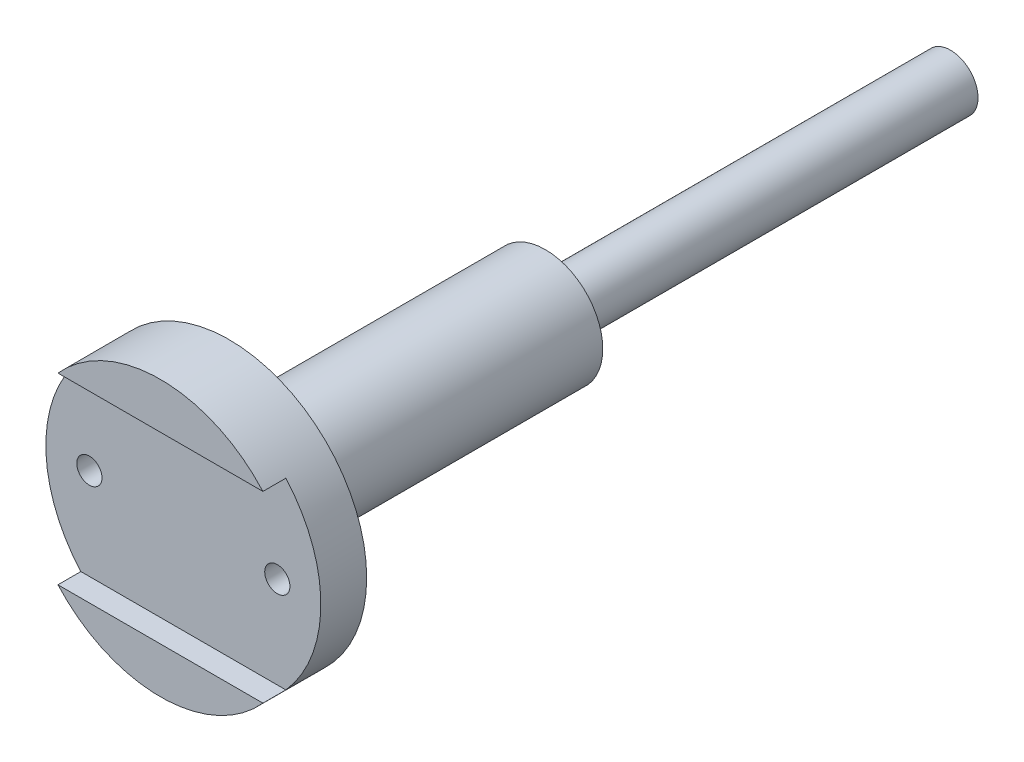
ISO-10303-21;
HEADER;
FILE_DESCRIPTION(('STEP AP214'),'2;1');
FILE_NAME('part.step','',(''),(''),'','','');
FILE_SCHEMA(('AUTOMOTIVE_DESIGN { 1 0 10303 214 1 1 1 1 }'));
ENDSEC;
DATA;
#1=APPLICATION_CONTEXT('core data for automotive mechanical design processes');
#2=APPLICATION_PROTOCOL_DEFINITION('international standard','automotive_design',2000,#1);
#3=PRODUCT_CONTEXT('',#1,'mechanical');
#4=PRODUCT('Part','Part','',(#3));
#5=PRODUCT_RELATED_PRODUCT_CATEGORY('part','',(#4));
#6=PRODUCT_DEFINITION_FORMATION('','',#4);
#7=PRODUCT_DEFINITION_CONTEXT('part definition',#1,'design');
#8=PRODUCT_DEFINITION('design','',#6,#7);
#9=PRODUCT_DEFINITION_SHAPE('','',#8);
#10=(LENGTH_UNIT() NAMED_UNIT(*) SI_UNIT(.MILLI.,.METRE.));
#11=(NAMED_UNIT(*) PLANE_ANGLE_UNIT() SI_UNIT($,.RADIAN.));
#12=(NAMED_UNIT(*) SI_UNIT($,.STERADIAN.) SOLID_ANGLE_UNIT());
#13=UNCERTAINTY_MEASURE_WITH_UNIT(LENGTH_MEASURE(1.E-05),#10,'distance_accuracy_value','');
#14=(GEOMETRIC_REPRESENTATION_CONTEXT(3) GLOBAL_UNCERTAINTY_ASSIGNED_CONTEXT((#13)) GLOBAL_UNIT_ASSIGNED_CONTEXT((#10,
#11,#12)) REPRESENTATION_CONTEXT('',''));
#15=CARTESIAN_POINT('',(0.,0.,0.));
#16=DIRECTION('',(0.,0.,1.));
#17=DIRECTION('',(1.,0.,0.));
#18=AXIS2_PLACEMENT_3D('',#15,#16,#17);
#19=CARTESIAN_POINT('',(0.,0.,0.));
#20=DIRECTION('',(0.,0.,1.));
#21=DIRECTION('',(1.,0.,0.));
#22=AXIS2_PLACEMENT_3D('',#19,#20,#21);
#23=PLANE('',#22);
#24=CARTESIAN_POINT('',(20.5,0.,0.));
#25=DIRECTION('',(0.,0.,-1.));
#26=DIRECTION('',(-1.,0.,0.));
#27=AXIS2_PLACEMENT_3D('',#24,#25,#26);
#28=CIRCLE('',#27,6.12);
#29=CARTESIAN_POINT('',(14.38,0.,0.));
#30=VERTEX_POINT('',#29);
#31=EDGE_CURVE('E150',#30,#30,#28,.T.);
#32=ORIENTED_EDGE('',*,*,#31,.F.);
#33=EDGE_LOOP('',(#32));
#34=FACE_BOUND('',#33,.T.);
#35=CARTESIAN_POINT('',(0.,0.,0.));
#36=DIRECTION('',(0.,0.,1.));
#37=DIRECTION('',(1.,0.,0.));
#38=AXIS2_PLACEMENT_3D('',#35,#36,#37);
#39=CIRCLE('',#38,12.5);
#40=CARTESIAN_POINT('',(12.5,0.,0.));
#41=VERTEX_POINT('',#40);
#42=EDGE_CURVE('E186',#41,#41,#39,.F.);
#43=ORIENTED_EDGE('',*,*,#42,.F.);
#44=EDGE_LOOP('',(#43));
#45=FACE_BOUND('',#44,.T.);
#46=CARTESIAN_POINT('',(0.,0.,0.));
#47=DIRECTION('',(0.,0.,1.));
#48=DIRECTION('',(1.,0.,0.));
#49=AXIS2_PLACEMENT_3D('',#46,#47,#48);
#50=CIRCLE('',#49,30.);
#51=CARTESIAN_POINT('',(30.,0.,0.));
#52=VERTEX_POINT('',#51);
#53=EDGE_CURVE('E182',#52,#52,#50,.T.);
#54=ORIENTED_EDGE('',*,*,#53,.F.);
#55=EDGE_LOOP('',(#54));
#56=FACE_BOUND('',#55,.T.);
#57=CARTESIAN_POINT('',(-20.5,0.,0.));
#58=DIRECTION('',(0.,0.,-1.));
#59=DIRECTION('',(-1.,0.,0.));
#60=AXIS2_PLACEMENT_3D('',#57,#58,#59);
#61=CIRCLE('',#60,6.12);
#62=CARTESIAN_POINT('',(-26.62,0.,0.));
#63=VERTEX_POINT('',#62);
#64=EDGE_CURVE('E135',#63,#63,#61,.T.);
#65=ORIENTED_EDGE('',*,*,#64,.F.);
#66=EDGE_LOOP('',(#65));
#67=FACE_BOUND('',#66,.T.);
#68=ADVANCED_FACE('F35',(#34,#45,#56,#67),#23,.F.);
#69=CARTESIAN_POINT('',(0.,0.,15.));
#70=DIRECTION('',(0.,0.,1.));
#71=DIRECTION('',(1.,0.,0.));
#72=AXIS2_PLACEMENT_3D('',#69,#70,#71);
#73=PLANE('',#72);
#74=DIRECTION('',(-1.,0.,0.));
#75=VECTOR('',#74,1.);
#76=CARTESIAN_POINT('',(0.,20.,15.));
#77=LINE('',#76,#75);
#78=CARTESIAN_POINT('',(22.3606797749979,20.,15.));
#79=VERTEX_POINT('',#78);
#80=CARTESIAN_POINT('',(-22.3606797749979,20.,15.));
#81=VERTEX_POINT('',#80);
#82=EDGE_CURVE('E194',#79,#81,#77,.T.);
#83=ORIENTED_EDGE('',*,*,#82,.F.);
#84=CARTESIAN_POINT('',(0.,0.,15.));
#85=DIRECTION('',(0.,0.,1.));
#86=DIRECTION('',(1.,0.,0.));
#87=AXIS2_PLACEMENT_3D('',#84,#85,#86);
#88=CIRCLE('',#87,30.);
#89=EDGE_CURVE('E183',#79,#81,#88,.T.);
#90=ORIENTED_EDGE('',*,*,#89,.T.);
#91=EDGE_LOOP('',(#83,#90));
#92=FACE_BOUND('',#91,.T.);
#93=ADVANCED_FACE('F216',(#92),#73,.T.);
#94=CARTESIAN_POINT('',(0.,0.,15.));
#95=DIRECTION('',(0.,0.,-1.));
#96=DIRECTION('',(-1.,0.,0.));
#97=AXIS2_PLACEMENT_3D('',#94,#95,#96);
#98=CYLINDRICAL_SURFACE('',#97,30.);
#99=ORIENTED_EDGE('',*,*,#89,.F.);
#100=DIRECTION('',(0.,0.,-1.));
#101=VECTOR('',#100,1.);
#102=CARTESIAN_POINT('',(22.3606797749979,20.,15.));
#103=LINE('',#102,#101);
#104=CARTESIAN_POINT('',(22.3606797749979,20.,10.));
#105=VERTEX_POINT('',#104);
#106=EDGE_CURVE('E176',#79,#105,#103,.T.);
#107=ORIENTED_EDGE('',*,*,#106,.T.);
#108=CARTESIAN_POINT('',(0.,0.,10.));
#109=DIRECTION('',(0.,0.,-1.));
#110=DIRECTION('',(-1.,0.,0.));
#111=AXIS2_PLACEMENT_3D('',#108,#109,#110);
#112=CIRCLE('',#111,30.);
#113=CARTESIAN_POINT('',(22.3606797749979,-20.,10.));
#114=VERTEX_POINT('',#113);
#115=EDGE_CURVE('E199',#105,#114,#112,.T.);
#116=ORIENTED_EDGE('',*,*,#115,.T.);
#117=DIRECTION('',(0.,0.,-1.));
#118=VECTOR('',#117,1.);
#119=CARTESIAN_POINT('',(22.3606797749979,-20.,15.));
#120=LINE('',#119,#118);
#121=CARTESIAN_POINT('',(22.3606797749979,-20.,15.));
#122=VERTEX_POINT('',#121);
#123=EDGE_CURVE('E169',#114,#122,#120,.F.);
#124=ORIENTED_EDGE('',*,*,#123,.T.);
#125=CARTESIAN_POINT('',(-22.3606797749979,-20.,15.));
#126=VERTEX_POINT('',#125);
#127=EDGE_CURVE('E187',#126,#122,#88,.T.);
#128=ORIENTED_EDGE('',*,*,#127,.F.);
#129=DIRECTION('',(0.,0.,-1.));
#130=VECTOR('',#129,1.);
#131=CARTESIAN_POINT('',(-22.3606797749979,-20.,15.));
#132=LINE('',#131,#130);
#133=CARTESIAN_POINT('',(-22.3606797749979,-20.,10.));
#134=VERTEX_POINT('',#133);
#135=EDGE_CURVE('E58',#126,#134,#132,.T.);
#136=ORIENTED_EDGE('',*,*,#135,.T.);
#137=CARTESIAN_POINT('',(-22.3606797749979,20.,10.));
#138=VERTEX_POINT('',#137);
#139=EDGE_CURVE('E196',#134,#138,#112,.T.);
#140=ORIENTED_EDGE('',*,*,#139,.T.);
#141=DIRECTION('',(0.,0.,-1.));
#142=VECTOR('',#141,1.);
#143=CARTESIAN_POINT('',(-22.3606797749979,20.,15.));
#144=LINE('',#143,#142);
#145=EDGE_CURVE('E173',#138,#81,#144,.F.);
#146=ORIENTED_EDGE('',*,*,#145,.T.);
#147=EDGE_LOOP('',(#99,#107,#116,#124,#128,#136,#140,#146));
#148=FACE_BOUND('',#147,.T.);
#149=ORIENTED_EDGE('',*,*,#53,.T.);
#150=EDGE_LOOP('',(#149));
#151=FACE_BOUND('',#150,.T.);
#152=ADVANCED_FACE('F37',(#148,#151),#98,.T.);
#153=DIRECTION('',(1.,0.,0.));
#154=VECTOR('',#153,1.);
#155=CARTESIAN_POINT('',(0.,-20.,15.));
#156=LINE('',#155,#154);
#157=EDGE_CURVE('E192',#126,#122,#156,.T.);
#158=ORIENTED_EDGE('',*,*,#157,.F.);
#159=ORIENTED_EDGE('',*,*,#127,.T.);
#160=EDGE_LOOP('',(#158,#159));
#161=FACE_BOUND('',#160,.T.);
#162=ADVANCED_FACE('F219',(#161),#73,.T.);
#163=CARTESIAN_POINT('',(0.,0.,-69.));
#164=DIRECTION('',(0.,0.,1.));
#165=DIRECTION('',(1.,0.,0.));
#166=AXIS2_PLACEMENT_3D('',#163,#164,#165);
#167=CYLINDRICAL_SURFACE('',#166,12.5);
#168=CARTESIAN_POINT('',(0.,0.,-69.));
#169=DIRECTION('',(0.,0.,-1.));
#170=DIRECTION('',(-1.,0.,0.));
#171=AXIS2_PLACEMENT_3D('',#168,#169,#170);
#172=CIRCLE('',#171,12.5);
#173=CARTESIAN_POINT('',(-12.5,0.,-69.));
#174=VERTEX_POINT('',#173);
#175=EDGE_CURVE('E179',#174,#174,#172,.T.);
#176=ORIENTED_EDGE('',*,*,#175,.F.);
#177=EDGE_LOOP('',(#176));
#178=FACE_BOUND('',#177,.T.);
#179=ORIENTED_EDGE('',*,*,#42,.T.);
#180=EDGE_LOOP('',(#179));
#181=FACE_BOUND('',#180,.T.);
#182=ADVANCED_FACE('F227',(#178,#181),#167,.T.);
#183=CARTESIAN_POINT('',(0.,0.,-69.));
#184=DIRECTION('',(0.,0.,-1.));
#185=DIRECTION('',(-1.,0.,0.));
#186=AXIS2_PLACEMENT_3D('',#183,#184,#185);
#187=PLANE('',#186);
#188=CARTESIAN_POINT('',(0.,0.,-69.));
#189=DIRECTION('',(0.,0.,-1.));
#190=DIRECTION('',(-1.,0.,0.));
#191=AXIS2_PLACEMENT_3D('',#188,#189,#190);
#192=CIRCLE('',#191,6.);
#193=CARTESIAN_POINT('',(-6.,0.,-69.));
#194=VERTEX_POINT('',#193);
#195=EDGE_CURVE('E131',#194,#194,#192,.T.);
#196=ORIENTED_EDGE('',*,*,#195,.F.);
#197=EDGE_LOOP('',(#196));
#198=FACE_BOUND('',#197,.T.);
#199=ORIENTED_EDGE('',*,*,#175,.T.);
#200=EDGE_LOOP('',(#199));
#201=FACE_BOUND('',#200,.T.);
#202=ADVANCED_FACE('F232',(#198,#201),#187,.T.);
#203=CARTESIAN_POINT('',(0.,0.,10.));
#204=DIRECTION('',(0.,0.,-1.));
#205=DIRECTION('',(-1.,0.,0.));
#206=AXIS2_PLACEMENT_3D('',#203,#204,#205);
#207=PLANE('',#206);
#208=CARTESIAN_POINT('',(-20.5,0.,10.));
#209=DIRECTION('',(0.,0.,-1.));
#210=DIRECTION('',(-1.,0.,0.));
#211=AXIS2_PLACEMENT_3D('',#208,#209,#210);
#212=CIRCLE('',#211,2.75);
#213=CARTESIAN_POINT('',(-23.25,0.,10.));
#214=VERTEX_POINT('',#213);
#215=EDGE_CURVE('E149',#214,#214,#212,.T.);
#216=ORIENTED_EDGE('',*,*,#215,.T.);
#217=EDGE_LOOP('',(#216));
#218=FACE_BOUND('',#217,.T.);
#219=CARTESIAN_POINT('',(20.5,0.,10.));
#220=DIRECTION('',(0.,0.,-1.));
#221=DIRECTION('',(-1.,0.,0.));
#222=AXIS2_PLACEMENT_3D('',#219,#220,#221);
#223=CIRCLE('',#222,2.75);
#224=CARTESIAN_POINT('',(17.75,0.,10.));
#225=VERTEX_POINT('',#224);
#226=EDGE_CURVE('E162',#225,#225,#223,.T.);
#227=ORIENTED_EDGE('',*,*,#226,.T.);
#228=EDGE_LOOP('',(#227));
#229=FACE_BOUND('',#228,.T.);
#230=DIRECTION('',(-1.,0.,0.));
#231=VECTOR('',#230,1.);
#232=CARTESIAN_POINT('',(115.,20.,10.));
#233=LINE('',#232,#231);
#234=EDGE_CURVE('E166',#105,#138,#233,.T.);
#235=ORIENTED_EDGE('',*,*,#234,.T.);
#236=ORIENTED_EDGE('',*,*,#139,.F.);
#237=DIRECTION('',(1.,0.,0.));
#238=VECTOR('',#237,1.);
#239=CARTESIAN_POINT('',(115.,-20.,10.));
#240=LINE('',#239,#238);
#241=EDGE_CURVE('E163',#134,#114,#240,.T.);
#242=ORIENTED_EDGE('',*,*,#241,.T.);
#243=ORIENTED_EDGE('',*,*,#115,.F.);
#244=EDGE_LOOP('',(#235,#236,#242,#243));
#245=FACE_BOUND('',#244,.T.);
#246=ADVANCED_FACE('F211',(#218,#229,#245),#207,.F.);
#247=CARTESIAN_POINT('',(115.,20.,10.));
#248=DIRECTION('',(0.,1.,0.));
#249=DIRECTION('',(-1.,0.,0.));
#250=AXIS2_PLACEMENT_3D('',#247,#248,#249);
#251=PLANE('',#250);
#252=ORIENTED_EDGE('',*,*,#82,.T.);
#253=ORIENTED_EDGE('',*,*,#145,.F.);
#254=ORIENTED_EDGE('',*,*,#234,.F.);
#255=ORIENTED_EDGE('',*,*,#106,.F.);
#256=EDGE_LOOP('',(#252,#253,#254,#255));
#257=FACE_BOUND('',#256,.T.);
#258=ADVANCED_FACE('F213',(#257),#251,.F.);
#259=CARTESIAN_POINT('',(115.,-20.,10.));
#260=DIRECTION('',(0.,-1.,0.));
#261=DIRECTION('',(1.,0.,0.));
#262=AXIS2_PLACEMENT_3D('',#259,#260,#261);
#263=PLANE('',#262);
#264=ORIENTED_EDGE('',*,*,#157,.T.);
#265=ORIENTED_EDGE('',*,*,#123,.F.);
#266=ORIENTED_EDGE('',*,*,#241,.F.);
#267=ORIENTED_EDGE('',*,*,#135,.F.);
#268=EDGE_LOOP('',(#264,#265,#266,#267));
#269=FACE_BOUND('',#268,.T.);
#270=ADVANCED_FACE('F234',(#269),#263,.F.);
#271=CARTESIAN_POINT('',(20.5,0.,0.));
#272=DIRECTION('',(0.,0.,-1.));
#273=DIRECTION('',(-1.,0.,0.));
#274=AXIS2_PLACEMENT_3D('',#271,#272,#273);
#275=CYLINDRICAL_SURFACE('',#274,2.75);
#276=CARTESIAN_POINT('',(20.5,0.,3.60500000000001));
#277=DIRECTION('',(0.,0.,-1.));
#278=DIRECTION('',(-1.,0.,0.));
#279=AXIS2_PLACEMENT_3D('',#276,#277,#278);
#280=CIRCLE('',#279,2.75);
#281=CARTESIAN_POINT('',(17.75,0.,3.60500000000001));
#282=VERTEX_POINT('',#281);
#283=EDGE_CURVE('E159',#282,#282,#280,.T.);
#284=ORIENTED_EDGE('',*,*,#283,.T.);
#285=EDGE_LOOP('',(#284));
#286=FACE_BOUND('',#285,.T.);
#287=ORIENTED_EDGE('',*,*,#226,.F.);
#288=EDGE_LOOP('',(#287));
#289=FACE_BOUND('',#288,.T.);
#290=ADVANCED_FACE('F236',(#286,#289),#275,.F.);
#291=CARTESIAN_POINT('',(20.5,0.,3.58));
#292=DIRECTION('',(0.,0.,-1.));
#293=DIRECTION('',(-1.,0.,0.));
#294=AXIS2_PLACEMENT_3D('',#291,#292,#293);
#295=CONICAL_SURFACE('',#294,2.775,0.785398163397292);
#296=ORIENTED_EDGE('',*,*,#283,.F.);
#297=EDGE_LOOP('',(#296));
#298=FACE_BOUND('',#297,.T.);
#299=CARTESIAN_POINT('',(20.5,0.,3.58));
#300=DIRECTION('',(0.,0.,-1.));
#301=DIRECTION('',(-1.,0.,0.));
#302=AXIS2_PLACEMENT_3D('',#299,#300,#301);
#303=CIRCLE('',#302,2.775);
#304=CARTESIAN_POINT('',(17.725,0.,3.58));
#305=VERTEX_POINT('',#304);
#306=EDGE_CURVE('E156',#305,#305,#303,.T.);
#307=ORIENTED_EDGE('',*,*,#306,.T.);
#308=EDGE_LOOP('',(#307));
#309=FACE_BOUND('',#308,.T.);
#310=ADVANCED_FACE('F242',(#298,#309),#295,.F.);
#311=CARTESIAN_POINT('',(23.275,0.,3.58));
#312=DIRECTION('',(0.,0.,1.));
#313=DIRECTION('',(1.,0.,0.));
#314=AXIS2_PLACEMENT_3D('',#311,#312,#313);
#315=PLANE('',#314);
#316=ORIENTED_EDGE('',*,*,#306,.F.);
#317=EDGE_LOOP('',(#316));
#318=FACE_BOUND('',#317,.T.);
#319=CARTESIAN_POINT('',(20.5,0.,3.58));
#320=DIRECTION('',(0.,0.,-1.));
#321=DIRECTION('',(-1.,0.,0.));
#322=AXIS2_PLACEMENT_3D('',#319,#320,#321);
#323=CIRCLE('',#322,6.12);
#324=CARTESIAN_POINT('',(14.38,0.,3.58));
#325=VERTEX_POINT('',#324);
#326=EDGE_CURVE('E153',#325,#325,#323,.T.);
#327=ORIENTED_EDGE('',*,*,#326,.T.);
#328=EDGE_LOOP('',(#327));
#329=FACE_BOUND('',#328,.T.);
#330=ADVANCED_FACE('F294',(#318,#329),#315,.F.);
#331=CARTESIAN_POINT('',(20.5,0.,0.));
#332=DIRECTION('',(0.,0.,-1.));
#333=DIRECTION('',(-1.,0.,0.));
#334=AXIS2_PLACEMENT_3D('',#331,#332,#333);
#335=CYLINDRICAL_SURFACE('',#334,6.12);
#336=ORIENTED_EDGE('',*,*,#326,.F.);
#337=EDGE_LOOP('',(#336));
#338=FACE_BOUND('',#337,.T.);
#339=ORIENTED_EDGE('',*,*,#31,.T.);
#340=EDGE_LOOP('',(#339));
#341=FACE_BOUND('',#340,.T.);
#342=ADVANCED_FACE('F290',(#338,#341),#335,.F.);
#343=CARTESIAN_POINT('',(-20.5,0.,0.));
#344=DIRECTION('',(0.,0.,-1.));
#345=DIRECTION('',(-1.,0.,0.));
#346=AXIS2_PLACEMENT_3D('',#343,#344,#345);
#347=CYLINDRICAL_SURFACE('',#346,2.75);
#348=CARTESIAN_POINT('',(-20.5,0.,3.60500000000001));
#349=DIRECTION('',(0.,0.,-1.));
#350=DIRECTION('',(-1.,0.,0.));
#351=AXIS2_PLACEMENT_3D('',#348,#349,#350);
#352=CIRCLE('',#351,2.75);
#353=CARTESIAN_POINT('',(-23.25,0.,3.60500000000001));
#354=VERTEX_POINT('',#353);
#355=EDGE_CURVE('E146',#354,#354,#352,.T.);
#356=ORIENTED_EDGE('',*,*,#355,.T.);
#357=EDGE_LOOP('',(#356));
#358=FACE_BOUND('',#357,.T.);
#359=ORIENTED_EDGE('',*,*,#215,.F.);
#360=EDGE_LOOP('',(#359));
#361=FACE_BOUND('',#360,.T.);
#362=ADVANCED_FACE('F286',(#358,#361),#347,.F.);
#363=CARTESIAN_POINT('',(-20.5,0.,3.58));
#364=DIRECTION('',(0.,0.,-1.));
#365=DIRECTION('',(-1.,0.,0.));
#366=AXIS2_PLACEMENT_3D('',#363,#364,#365);
#367=CONICAL_SURFACE('',#366,2.775,0.785398163397292);
#368=ORIENTED_EDGE('',*,*,#355,.F.);
#369=EDGE_LOOP('',(#368));
#370=FACE_BOUND('',#369,.T.);
#371=CARTESIAN_POINT('',(-20.5,0.,3.58));
#372=DIRECTION('',(0.,0.,-1.));
#373=DIRECTION('',(-1.,0.,0.));
#374=AXIS2_PLACEMENT_3D('',#371,#372,#373);
#375=CIRCLE('',#374,2.775);
#376=CARTESIAN_POINT('',(-23.275,0.,3.58));
#377=VERTEX_POINT('',#376);
#378=EDGE_CURVE('E143',#377,#377,#375,.T.);
#379=ORIENTED_EDGE('',*,*,#378,.T.);
#380=EDGE_LOOP('',(#379));
#381=FACE_BOUND('',#380,.T.);
#382=ADVANCED_FACE('F278',(#370,#381),#367,.F.);
#383=CARTESIAN_POINT('',(-17.725,0.,3.58));
#384=DIRECTION('',(0.,0.,1.));
#385=DIRECTION('',(1.,0.,0.));
#386=AXIS2_PLACEMENT_3D('',#383,#384,#385);
#387=PLANE('',#386);
#388=ORIENTED_EDGE('',*,*,#378,.F.);
#389=EDGE_LOOP('',(#388));
#390=FACE_BOUND('',#389,.T.);
#391=CARTESIAN_POINT('',(-20.5,0.,3.58));
#392=DIRECTION('',(0.,0.,-1.));
#393=DIRECTION('',(-1.,0.,0.));
#394=AXIS2_PLACEMENT_3D('',#391,#392,#393);
#395=CIRCLE('',#394,6.12);
#396=CARTESIAN_POINT('',(-26.62,0.,3.58));
#397=VERTEX_POINT('',#396);
#398=EDGE_CURVE('E140',#397,#397,#395,.T.);
#399=ORIENTED_EDGE('',*,*,#398,.T.);
#400=EDGE_LOOP('',(#399));
#401=FACE_BOUND('',#400,.T.);
#402=ADVANCED_FACE('F268',(#390,#401),#387,.F.);
#403=CARTESIAN_POINT('',(-20.5,0.,0.));
#404=DIRECTION('',(0.,0.,-1.));
#405=DIRECTION('',(-1.,0.,0.));
#406=AXIS2_PLACEMENT_3D('',#403,#404,#405);
#407=CYLINDRICAL_SURFACE('',#406,6.12);
#408=ORIENTED_EDGE('',*,*,#398,.F.);
#409=EDGE_LOOP('',(#408));
#410=FACE_BOUND('',#409,.T.);
#411=ORIENTED_EDGE('',*,*,#64,.T.);
#412=EDGE_LOOP('',(#411));
#413=FACE_BOUND('',#412,.T.);
#414=ADVANCED_FACE('F265',(#410,#413),#407,.F.);
#415=CARTESIAN_POINT('',(0.,0.,-157.38));
#416=DIRECTION('',(0.,0.,1.));
#417=DIRECTION('',(1.,0.,0.));
#418=AXIS2_PLACEMENT_3D('',#415,#416,#417);
#419=CYLINDRICAL_SURFACE('',#418,6.);
#420=CARTESIAN_POINT('',(0.,0.,-154.38));
#421=DIRECTION('',(0.,0.,-1.));
#422=DIRECTION('',(-1.,0.,0.));
#423=AXIS2_PLACEMENT_3D('',#420,#421,#422);
#424=CIRCLE('',#423,6.);
#425=CARTESIAN_POINT('',(-5.80947501931113,-1.5,-154.38));
#426=VERTEX_POINT('',#425);
#427=CARTESIAN_POINT('',(-5.80947501931113,1.5,-154.38));
#428=VERTEX_POINT('',#427);
#429=EDGE_CURVE('E11',#426,#428,#424,.T.);
#430=ORIENTED_EDGE('',*,*,#429,.F.);
#431=DIRECTION('',(0.,0.,1.));
#432=VECTOR('',#431,1.);
#433=CARTESIAN_POINT('',(-5.80947501931113,-1.5,-157.38));
#434=LINE('',#433,#432);
#435=CARTESIAN_POINT('',(-5.80947501931113,-1.5,-157.38));
#436=VERTEX_POINT('',#435);
#437=EDGE_CURVE('E128',#426,#436,#434,.F.);
#438=ORIENTED_EDGE('',*,*,#437,.T.);
#439=CARTESIAN_POINT('',(0.,0.,-157.38));
#440=DIRECTION('',(0.,0.,-1.));
#441=DIRECTION('',(-1.,0.,0.));
#442=AXIS2_PLACEMENT_3D('',#439,#440,#441);
#443=CIRCLE('',#442,6.);
#444=CARTESIAN_POINT('',(-5.80947501931113,1.5,-157.38));
#445=VERTEX_POINT('',#444);
#446=EDGE_CURVE('E132',#445,#436,#443,.T.);
#447=ORIENTED_EDGE('',*,*,#446,.F.);
#448=DIRECTION('',(0.,0.,1.));
#449=VECTOR('',#448,1.);
#450=CARTESIAN_POINT('',(-5.80947501931113,1.5,-157.38));
#451=LINE('',#450,#449);
#452=EDGE_CURVE('E50',#445,#428,#451,.T.);
#453=ORIENTED_EDGE('',*,*,#452,.T.);
#454=EDGE_LOOP('',(#430,#438,#447,#453));
#455=FACE_BOUND('',#454,.T.);
#456=ORIENTED_EDGE('',*,*,#195,.T.);
#457=EDGE_LOOP('',(#456));
#458=FACE_BOUND('',#457,.T.);
#459=ADVANCED_FACE('F267',(#455,#458),#419,.T.);
#460=CARTESIAN_POINT('',(0.,0.,-157.38));
#461=DIRECTION('',(0.,0.,-1.));
#462=DIRECTION('',(-1.,0.,0.));
#463=AXIS2_PLACEMENT_3D('',#460,#461,#462);
#464=PLANE('',#463);
#465=DIRECTION('',(-1.,0.,0.));
#466=VECTOR('',#465,1.);
#467=CARTESIAN_POINT('',(3.39095353514196,-1.5,-157.38));
#468=LINE('',#467,#466);
#469=CARTESIAN_POINT('',(3.39095353514196,-1.5,-157.38));
#470=VERTEX_POINT('',#469);
#471=EDGE_CURVE('E108',#470,#436,#468,.T.);
#472=ORIENTED_EDGE('',*,*,#471,.F.);
#473=DIRECTION('',(0.,-1.,0.));
#474=VECTOR('',#473,1.);
#475=CARTESIAN_POINT('',(3.39095353514196,1.5,-157.38));
#476=LINE('',#475,#474);
#477=CARTESIAN_POINT('',(3.39095353514196,1.5,-157.38));
#478=VERTEX_POINT('',#477);
#479=EDGE_CURVE('E123',#478,#470,#476,.T.);
#480=ORIENTED_EDGE('',*,*,#479,.F.);
#481=DIRECTION('',(1.,0.,0.));
#482=VECTOR('',#481,1.);
#483=CARTESIAN_POINT('',(0.,1.5,-157.38));
#484=LINE('',#483,#482);
#485=EDGE_CURVE('E43',#445,#478,#484,.T.);
#486=ORIENTED_EDGE('',*,*,#485,.F.);
#487=ORIENTED_EDGE('',*,*,#446,.T.);
#488=EDGE_LOOP('',(#472,#480,#486,#487));
#489=FACE_BOUND('',#488,.T.);
#490=ADVANCED_FACE('F275',(#489),#464,.T.);
#491=CARTESIAN_POINT('',(0.,0.,-154.38));
#492=DIRECTION('',(0.,0.,-1.));
#493=DIRECTION('',(-1.,0.,0.));
#494=AXIS2_PLACEMENT_3D('',#491,#492,#493);
#495=PLANE('',#494);
#496=ORIENTED_EDGE('',*,*,#429,.T.);
#497=DIRECTION('',(1.,0.,0.));
#498=VECTOR('',#497,1.);
#499=CARTESIAN_POINT('',(3.39095353514196,1.5,-154.38));
#500=LINE('',#499,#498);
#501=CARTESIAN_POINT('',(3.39095353514196,1.5,-154.38));
#502=VERTEX_POINT('',#501);
#503=EDGE_CURVE('E100',#428,#502,#500,.T.);
#504=ORIENTED_EDGE('',*,*,#503,.T.);
#505=DIRECTION('',(0.,-1.,0.));
#506=VECTOR('',#505,1.);
#507=CARTESIAN_POINT('',(3.39095353514196,1.5,-154.38));
#508=LINE('',#507,#506);
#509=CARTESIAN_POINT('',(3.39095353514196,-1.5,-154.38));
#510=VERTEX_POINT('',#509);
#511=EDGE_CURVE('E105',#502,#510,#508,.T.);
#512=ORIENTED_EDGE('',*,*,#511,.T.);
#513=DIRECTION('',(-1.,0.,0.));
#514=VECTOR('',#513,1.);
#515=CARTESIAN_POINT('',(3.39095353514196,-1.5,-154.38));
#516=LINE('',#515,#514);
#517=EDGE_CURVE('E117',#510,#426,#516,.T.);
#518=ORIENTED_EDGE('',*,*,#517,.T.);
#519=EDGE_LOOP('',(#496,#504,#512,#518));
#520=FACE_BOUND('',#519,.T.);
#521=ADVANCED_FACE('F102',(#520),#495,.T.);
#522=CARTESIAN_POINT('',(3.39095353514196,-1.5,-154.38));
#523=DIRECTION('',(0.,-1.,0.));
#524=DIRECTION('',(0.,0.,-1.));
#525=AXIS2_PLACEMENT_3D('',#522,#523,#524);
#526=PLANE('',#525);
#527=ORIENTED_EDGE('',*,*,#517,.F.);
#528=DIRECTION('',(0.,0.,-1.));
#529=VECTOR('',#528,1.);
#530=CARTESIAN_POINT('',(3.39095353514196,-1.5,-154.38));
#531=LINE('',#530,#529);
#532=EDGE_CURVE('E116',#510,#470,#531,.T.);
#533=ORIENTED_EDGE('',*,*,#532,.T.);
#534=ORIENTED_EDGE('',*,*,#471,.T.);
#535=ORIENTED_EDGE('',*,*,#437,.F.);
#536=EDGE_LOOP('',(#527,#533,#534,#535));
#537=FACE_BOUND('',#536,.T.);
#538=ADVANCED_FACE('F368',(#537),#526,.F.);
#539=CARTESIAN_POINT('',(3.39095353514196,1.5,-154.38));
#540=DIRECTION('',(0.,1.,0.));
#541=DIRECTION('',(0.,0.,1.));
#542=AXIS2_PLACEMENT_3D('',#539,#540,#541);
#543=PLANE('',#542);
#544=ORIENTED_EDGE('',*,*,#485,.T.);
#545=DIRECTION('',(0.,0.,-1.));
#546=VECTOR('',#545,1.);
#547=CARTESIAN_POINT('',(3.39095353514196,1.5,-154.38));
#548=LINE('',#547,#546);
#549=EDGE_CURVE('E111',#502,#478,#548,.T.);
#550=ORIENTED_EDGE('',*,*,#549,.F.);
#551=ORIENTED_EDGE('',*,*,#503,.F.);
#552=ORIENTED_EDGE('',*,*,#452,.F.);
#553=EDGE_LOOP('',(#544,#550,#551,#552));
#554=FACE_BOUND('',#553,.T.);
#555=ADVANCED_FACE('F112',(#554),#543,.F.);
#556=CARTESIAN_POINT('',(3.39095353514196,1.5,-154.38));
#557=DIRECTION('',(1.,0.,0.));
#558=DIRECTION('',(0.,1.,0.));
#559=AXIS2_PLACEMENT_3D('',#556,#557,#558);
#560=PLANE('',#559);
#561=ORIENTED_EDGE('',*,*,#479,.T.);
#562=ORIENTED_EDGE('',*,*,#532,.F.);
#563=ORIENTED_EDGE('',*,*,#511,.F.);
#564=ORIENTED_EDGE('',*,*,#549,.T.);
#565=EDGE_LOOP('',(#561,#562,#563,#564));
#566=FACE_BOUND('',#565,.T.);
#567=ADVANCED_FACE('F119',(#566),#560,.F.);
#568=CLOSED_SHELL('',(#68,#93,#152,#162,#182,#202,#246,#258,#270,#290,#310,#330,#342,#362,#382,
#402,#414,#459,#490,#521,#538,#555,#567));
#569=MANIFOLD_SOLID_BREP('B2',#568);
#570=ADVANCED_BREP_SHAPE_REPRESENTATION('',(#18,#569),#14);
#571=SHAPE_DEFINITION_REPRESENTATION(#9,#570);
ENDSEC;
END-ISO-10303-21;
